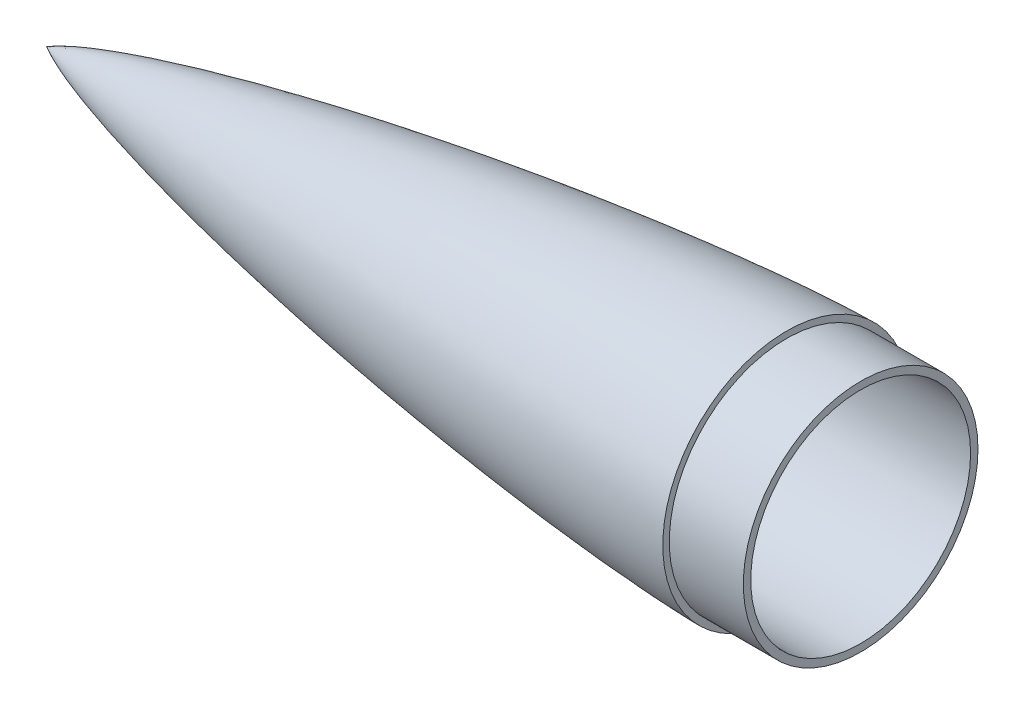
ISO-10303-21;
HEADER;
FILE_DESCRIPTION(('STEP AP214'),'2;1');
FILE_NAME('part.step','',(''),(''),'','','');
FILE_SCHEMA(('AUTOMOTIVE_DESIGN { 1 0 10303 214 1 1 1 1 }'));
ENDSEC;
DATA;
#1=APPLICATION_CONTEXT('core data for automotive mechanical design processes');
#2=APPLICATION_PROTOCOL_DEFINITION('international standard','automotive_design',2000,#1);
#3=PRODUCT_CONTEXT('',#1,'mechanical');
#4=PRODUCT('Part','Part','',(#3));
#5=PRODUCT_RELATED_PRODUCT_CATEGORY('part','',(#4));
#6=PRODUCT_DEFINITION_FORMATION('','',#4);
#7=PRODUCT_DEFINITION_CONTEXT('part definition',#1,'design');
#8=PRODUCT_DEFINITION('design','',#6,#7);
#9=PRODUCT_DEFINITION_SHAPE('','',#8);
#10=(LENGTH_UNIT() NAMED_UNIT(*) SI_UNIT(.MILLI.,.METRE.));
#11=(NAMED_UNIT(*) PLANE_ANGLE_UNIT() SI_UNIT($,.RADIAN.));
#12=(NAMED_UNIT(*) SI_UNIT($,.STERADIAN.) SOLID_ANGLE_UNIT());
#13=UNCERTAINTY_MEASURE_WITH_UNIT(LENGTH_MEASURE(1.E-05),#10,'distance_accuracy_value','');
#14=(GEOMETRIC_REPRESENTATION_CONTEXT(3) GLOBAL_UNCERTAINTY_ASSIGNED_CONTEXT((#13)) GLOBAL_UNIT_ASSIGNED_CONTEXT((#10,
#11,#12)) REPRESENTATION_CONTEXT('',''));
#15=CARTESIAN_POINT('',(0.,0.,0.));
#16=DIRECTION('',(0.,0.,1.));
#17=DIRECTION('',(1.,0.,0.));
#18=AXIS2_PLACEMENT_3D('',#15,#16,#17);
#19=CARTESIAN_POINT('',(200.,0.,-33.4355685150698));
#20=CARTESIAN_POINT('',(199.322179654003,0.,-33.4323383643763));
#21=CARTESIAN_POINT('',(197.96668201448,0.,-33.4109822420062));
#22=CARTESIAN_POINT('',(193.575946740602,0.,-33.2950534490437));
#23=CARTESIAN_POINT('',(186.154623569186,0.,-32.9539645763986));
#24=CARTESIAN_POINT('',(176.386553472775,0.,-32.3323949245245));
#25=CARTESIAN_POINT('',(164.280072944056,0.,-31.3478971261456));
#26=CARTESIAN_POINT('',(152.189147407201,0.,-30.1899129927248));
#27=CARTESIAN_POINT('',(140.114018126728,0.,-28.8775873685312));
#28=CARTESIAN_POINT('',(128.05522623978,0.,-27.4232989862083));
#29=CARTESIAN_POINT('',(116.013631476871,0.,-25.8328412652977));
#30=CARTESIAN_POINT('',(103.990482125065,0.,-24.1085760118513));
#31=CARTESIAN_POINT('',(91.9875106556967,0.,-22.248884905431));
#32=CARTESIAN_POINT('',(80.0071383039936,0.,-20.2486418789882));
#33=CARTESIAN_POINT('',(68.052752748457,0.,-18.0981923642982));
#34=CARTESIAN_POINT('',(56.1293217805533,0.,-15.7818096250316));
#35=CARTESIAN_POINT('',(44.2443671822434,0.,-13.2745922542246));
#36=CARTESIAN_POINT('',(33.2254451342742,0.,-10.7238520935605));
#37=CARTESIAN_POINT('',(23.7399008996518,0.,-8.29191144076045));
#38=CARTESIAN_POINT('',(16.1615279538934,0.,-6.12216645315078));
#39=CARTESIAN_POINT('',(10.7984161562651,0.,-4.41093759935858));
#40=CARTESIAN_POINT('',(7.06503905609062,0.,-3.08569859262728));
#41=CARTESIAN_POINT('',(4.42378862410607,0.,-2.04005703667645));
#42=CARTESIAN_POINT('',(2.70977796726177,0.,-1.28363377804088));
#43=CARTESIAN_POINT('',(1.58549241696781,0.,-0.737587827803518));
#44=CARTESIAN_POINT('',(0.90429535730028,0.,-0.386360833356651));
#45=CARTESIAN_POINT('',(0.549478166428491,0.,-0.203997996855062));
#46=CARTESIAN_POINT('',(0.304588775814575,0.,-0.0914897913141497));
#47=CARTESIAN_POINT('',(0.175151488046642,0.,-0.0408399449586508));
#48=CARTESIAN_POINT('',(0.0889645538634368,0.,-0.0127715996474495));
#49=CARTESIAN_POINT('',(0.0297309525910866,0.,-0.00266548567570939));
#50=CARTESIAN_POINT('',(0.,0.,0.));
#51=B_SPLINE_CURVE_WITH_KNOTS('',4,(#19,#20,#21,#22,#23,#24,#25,#26,#27,#28,#29,#30,#31,#32,#33,
#34,#35,#36,#37,#38,#39,#40,#41,#42,#43,#44,#45,#46,#47,#48,#49,#50),.UNSPECIFIED.,.F.,.F.,(5,1,
1,1,1,1,1,1,1,1,1,1,1,1,1,1,1,1,1,1,1,1,1,1,1,1,1,1,5),(0.,0.0133209642117482,
0.0266419284234964,0.0863167691697009,0.145991610068889,0.205666451663834,0.265341292558525,
0.325016131418618,0.384690973552768,0.444365812322199,0.50404065606741,0.563715493321218,
0.623390332433378,0.683065171883309,0.742740011906119,0.802414855634365,0.862089687624013,
0.905325029529881,0.935162430760937,0.957312634774657,0.972707485547451,0.983165991718057,
0.990977432175115,0.994122067130278,0.997266702085442,0.998227464598054,0.998817984622571,
0.999415053510214,1.),.UNSPECIFIED.);
#52=CARTESIAN_POINT('',(200.,0.,0.));
#53=DIRECTION('',(1.,0.,0.));
#54=AXIS1_PLACEMENT('',#52,#53);
#55=SURFACE_OF_REVOLUTION('',#51,#54);
#56=CARTESIAN_POINT('',(0.,0.,0.));
#57=VERTEX_POINT('',#56);
#58=VERTEX_LOOP('',#57);
#59=FACE_BOUND('',#58,.T.);
#60=CARTESIAN_POINT('',(200.,0.,0.));
#61=DIRECTION('',(1.,0.,0.));
#62=DIRECTION('',(0.,0.,-1.));
#63=AXIS2_PLACEMENT_3D('',#60,#61,#62);
#64=CIRCLE('',#63,33.4355685150698);
#65=CARTESIAN_POINT('',(200.,0.,-33.4355685150698));
#66=VERTEX_POINT('',#65);
#67=EDGE_CURVE('E12',#66,#66,#64,.T.);
#68=ORIENTED_EDGE('',*,*,#67,.F.);
#69=EDGE_LOOP('',(#68));
#70=FACE_BOUND('',#69,.T.);
#71=ADVANCED_FACE('F41',(#59,#70),#55,.F.);
#72=CARTESIAN_POINT('',(200.,0.,-33.4355685150698));
#73=DIRECTION('',(1.,0.,0.));
#74=DIRECTION('',(0.,0.,-1.));
#75=AXIS2_PLACEMENT_3D('',#72,#73,#74);
#76=PLANE('',#75);
#77=CARTESIAN_POINT('',(200.,0.,0.));
#78=DIRECTION('',(1.,0.,0.));
#79=DIRECTION('',(0.,0.,-1.));
#80=AXIS2_PLACEMENT_3D('',#77,#78,#79);
#81=CIRCLE('',#80,31.6855482124485);
#82=CARTESIAN_POINT('',(200.,0.,-31.6855482124485));
#83=VERTEX_POINT('',#82);
#84=EDGE_CURVE('E48',#83,#83,#81,.T.);
#85=ORIENTED_EDGE('',*,*,#84,.F.);
#86=EDGE_LOOP('',(#85));
#87=FACE_BOUND('',#86,.T.);
#88=ORIENTED_EDGE('',*,*,#67,.T.);
#89=EDGE_LOOP('',(#88));
#90=FACE_BOUND('',#89,.T.);
#91=ADVANCED_FACE('F69',(#87,#90),#76,.T.);
#92=CARTESIAN_POINT('',(220.,0.,0.));
#93=DIRECTION('',(1.,0.,0.));
#94=DIRECTION('',(0.,0.,-1.));
#95=AXIS2_PLACEMENT_3D('',#92,#93,#94);
#96=PLANE('',#95);
#97=CARTESIAN_POINT('',(220.,0.,0.));
#98=DIRECTION('',(1.,0.,0.));
#99=DIRECTION('',(0.,0.,-1.));
#100=AXIS2_PLACEMENT_3D('',#97,#98,#99);
#101=CIRCLE('',#100,31.6855482124485);
#102=CARTESIAN_POINT('',(220.,0.,-31.6855482124485));
#103=VERTEX_POINT('',#102);
#104=EDGE_CURVE('E101',#103,#103,#101,.T.);
#105=ORIENTED_EDGE('',*,*,#104,.T.);
#106=EDGE_LOOP('',(#105));
#107=FACE_BOUND('',#106,.T.);
#108=CARTESIAN_POINT('',(220.,0.,0.));
#109=DIRECTION('',(1.,0.,0.));
#110=DIRECTION('',(0.,0.,-1.));
#111=AXIS2_PLACEMENT_3D('',#108,#109,#110);
#112=CIRCLE('',#111,29.6855482124485);
#113=CARTESIAN_POINT('',(220.,0.,-29.6855482124485));
#114=VERTEX_POINT('',#113);
#115=EDGE_CURVE('E104',#114,#114,#112,.T.);
#116=ORIENTED_EDGE('',*,*,#115,.F.);
#117=EDGE_LOOP('',(#116));
#118=FACE_BOUND('',#117,.T.);
#119=ADVANCED_FACE('F73',(#107,#118),#96,.T.);
#120=CARTESIAN_POINT('',(220.,0.,0.));
#121=DIRECTION('',(-1.,0.,0.));
#122=DIRECTION('',(0.,0.,1.));
#123=AXIS2_PLACEMENT_3D('',#120,#121,#122);
#124=CYLINDRICAL_SURFACE('',#123,31.6855482124485);
#125=ORIENTED_EDGE('',*,*,#104,.F.);
#126=EDGE_LOOP('',(#125));
#127=FACE_BOUND('',#126,.T.);
#128=ORIENTED_EDGE('',*,*,#84,.T.);
#129=EDGE_LOOP('',(#128));
#130=FACE_BOUND('',#129,.T.);
#131=ADVANCED_FACE('F62',(#127,#130),#124,.T.);
#132=CARTESIAN_POINT('',(220.,0.,0.));
#133=DIRECTION('',(-1.,0.,0.));
#134=DIRECTION('',(0.,0.,1.));
#135=AXIS2_PLACEMENT_3D('',#132,#133,#134);
#136=CYLINDRICAL_SURFACE('',#135,29.6855482124485);
#137=ORIENTED_EDGE('',*,*,#115,.T.);
#138=EDGE_LOOP('',(#137));
#139=FACE_BOUND('',#138,.T.);
#140=CARTESIAN_POINT('',(165.77322263538,0.,0.));
#141=DIRECTION('',(1.,0.,0.));
#142=DIRECTION('',(0.,0.,-1.));
#143=AXIS2_PLACEMENT_3D('',#140,#141,#142);
#144=CIRCLE('',#143,29.6855482124485);
#145=CARTESIAN_POINT('',(165.77322263538,0.,-29.6855482124485));
#146=VERTEX_POINT('',#145);
#147=EDGE_CURVE('E107',#146,#146,#144,.T.);
#148=ORIENTED_EDGE('',*,*,#147,.F.);
#149=EDGE_LOOP('',(#148));
#150=FACE_BOUND('',#149,.T.);
#151=ADVANCED_FACE('F56',(#139,#150),#136,.F.);
#152=CARTESIAN_POINT('',(200.,0.,-33.4355685150698));
#153=CARTESIAN_POINT('',(199.322179654003,0.,-33.4323383643763));
#154=CARTESIAN_POINT('',(197.96668201448,0.,-33.4109822420062));
#155=CARTESIAN_POINT('',(193.575946740602,0.,-33.2950534490437));
#156=CARTESIAN_POINT('',(186.154623569186,0.,-32.9539645763986));
#157=CARTESIAN_POINT('',(176.386553472775,0.,-32.3323949245245));
#158=CARTESIAN_POINT('',(164.280072944056,0.,-31.3478971261456));
#159=CARTESIAN_POINT('',(152.189147407201,0.,-30.1899129927248));
#160=CARTESIAN_POINT('',(140.114018126728,0.,-28.8775873685312));
#161=CARTESIAN_POINT('',(128.05522623978,0.,-27.4232989862083));
#162=CARTESIAN_POINT('',(116.013631476871,0.,-25.8328412652977));
#163=CARTESIAN_POINT('',(103.990482125065,0.,-24.1085760118513));
#164=CARTESIAN_POINT('',(91.9875106556967,0.,-22.248884905431));
#165=CARTESIAN_POINT('',(80.0071383039936,0.,-20.2486418789882));
#166=CARTESIAN_POINT('',(68.052752748457,0.,-18.0981923642982));
#167=CARTESIAN_POINT('',(56.1293217805533,0.,-15.7818096250316));
#168=CARTESIAN_POINT('',(44.2443671822434,0.,-13.2745922542246));
#169=CARTESIAN_POINT('',(33.2254451342742,0.,-10.7238520935605));
#170=CARTESIAN_POINT('',(23.7399008996518,0.,-8.29191144076045));
#171=CARTESIAN_POINT('',(16.1615279538934,0.,-6.12216645315078));
#172=CARTESIAN_POINT('',(10.7984161562651,0.,-4.41093759935858));
#173=CARTESIAN_POINT('',(7.15446609725211,0.,-3.11744256062833));
#174=CARTESIAN_POINT('',(4.96995131345689,0.,-2.25613461671395));
#175=CARTESIAN_POINT('',(3.84672985171564,0.,-1.7780436069638));
#176=CARTESIAN_POINT('',(3.44639537802266,0.,-1.60209691594584));
#177=B_SPLINE_CURVE_WITH_KNOTS('',4,(#152,#153,#154,#155,#156,#157,#158,#159,#160,#161,#162,
#163,#164,#165,#166,#167,#168,#169,#170,#171,#172,#173,#174,#175,#176),.UNSPECIFIED.,.F.,.F.,(5,
1,1,1,1,1,1,1,1,1,1,1,1,1,1,1,1,1,1,1,1,5),(0.,0.0133209642117482,0.0266419284234964,
0.0863167691697009,0.145991610068889,0.205666451663834,0.265341292558525,0.325016131418618,
0.384690973552768,0.444365812322199,0.50404065606741,0.563715493321218,0.623390332433378,
0.683065171883309,0.742740011906119,0.802414855634365,0.862089687624013,0.905325029529881,
0.935162430760937,0.957312634774657,0.972707485547451,0.981301436720565),.UNSPECIFIED.);
#178=CARTESIAN_POINT('',(200.,0.,0.));
#179=DIRECTION('',(1.,0.,0.));
#180=AXIS1_PLACEMENT('',#178,#179);
#181=SURFACE_OF_REVOLUTION('',#177,#180);
#182=OFFSET_SURFACE('',#181,1.75,.F.);
#183=ORIENTED_EDGE('',*,*,#147,.T.);
#184=EDGE_LOOP('',(#183));
#185=FACE_BOUND('',#184,.T.);
#186=CARTESIAN_POINT('',(4.15051573131235,0.,0.));
#187=VERTEX_POINT('',#186);
#188=VERTEX_LOOP('',#187);
#189=FACE_BOUND('',#188,.T.);
#190=ADVANCED_FACE('F54',(#185,#189),#182,.T.);
#191=CLOSED_SHELL('',(#71,#91,#119,#131,#151,#190));
#192=MANIFOLD_SOLID_BREP('B2',#191);
#193=ADVANCED_BREP_SHAPE_REPRESENTATION('',(#18,#192),#14);
#194=SHAPE_DEFINITION_REPRESENTATION(#9,#193);
ENDSEC;
END-ISO-10303-21;
